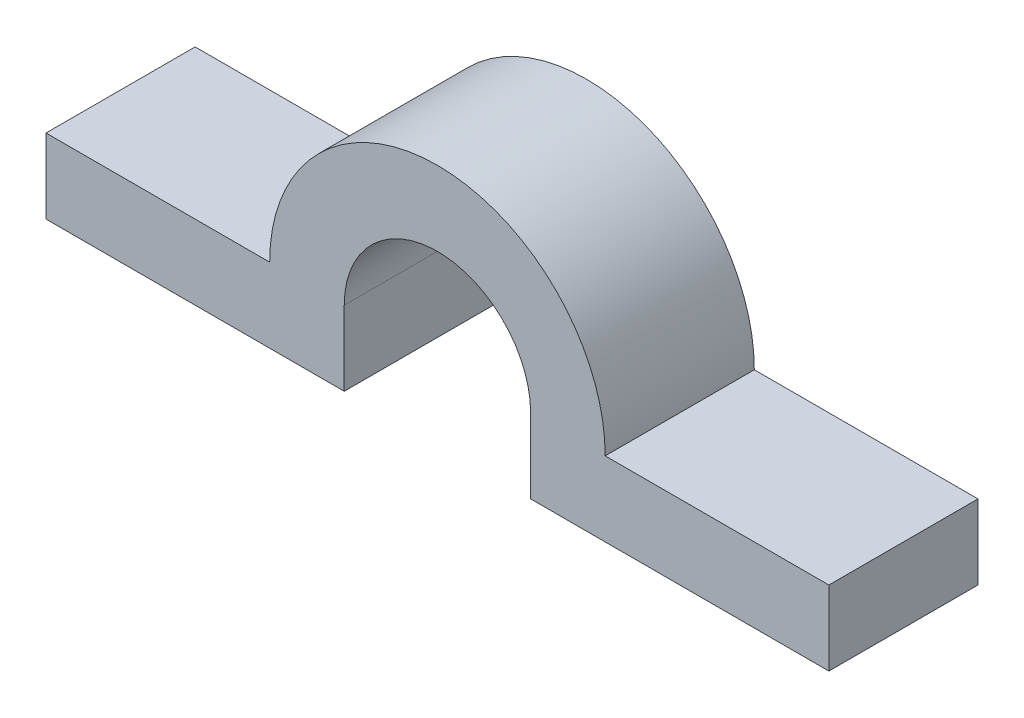
ISO-10303-21;
HEADER;
FILE_DESCRIPTION(('STEP AP214'),'2;1');
FILE_NAME('part.step','',(''),(''),'','','');
FILE_SCHEMA(('AUTOMOTIVE_DESIGN { 1 0 10303 214 1 1 1 1 }'));
ENDSEC;
DATA;
#1=APPLICATION_CONTEXT('core data for automotive mechanical design processes');
#2=APPLICATION_PROTOCOL_DEFINITION('international standard','automotive_design',2000,#1);
#3=PRODUCT_CONTEXT('',#1,'mechanical');
#4=PRODUCT('Part','Part','',(#3));
#5=PRODUCT_RELATED_PRODUCT_CATEGORY('part','',(#4));
#6=PRODUCT_DEFINITION_FORMATION('','',#4);
#7=PRODUCT_DEFINITION_CONTEXT('part definition',#1,'design');
#8=PRODUCT_DEFINITION('design','',#6,#7);
#9=PRODUCT_DEFINITION_SHAPE('','',#8);
#10=(LENGTH_UNIT() NAMED_UNIT(*) SI_UNIT(.MILLI.,.METRE.));
#11=(NAMED_UNIT(*) PLANE_ANGLE_UNIT() SI_UNIT($,.RADIAN.));
#12=(NAMED_UNIT(*) SI_UNIT($,.STERADIAN.) SOLID_ANGLE_UNIT());
#13=UNCERTAINTY_MEASURE_WITH_UNIT(LENGTH_MEASURE(1.E-05),#10,'distance_accuracy_value','');
#14=(GEOMETRIC_REPRESENTATION_CONTEXT(3) GLOBAL_UNCERTAINTY_ASSIGNED_CONTEXT((#13)) GLOBAL_UNIT_ASSIGNED_CONTEXT((#10,
#11,#12)) REPRESENTATION_CONTEXT('',''));
#15=CARTESIAN_POINT('',(0.,0.,0.));
#16=DIRECTION('',(0.,0.,1.));
#17=DIRECTION('',(1.,0.,0.));
#18=AXIS2_PLACEMENT_3D('',#15,#16,#17);
#19=CARTESIAN_POINT('',(13.,0.,8.));
#20=DIRECTION('',(0.,0.,-1.));
#21=DIRECTION('',(-1.,0.,0.));
#22=AXIS2_PLACEMENT_3D('',#19,#20,#21);
#23=CYLINDRICAL_SURFACE('',#22,5.);
#24=CARTESIAN_POINT('',(13.,0.,0.));
#25=DIRECTION('',(0.,0.,-1.));
#26=DIRECTION('',(1.,0.,0.));
#27=AXIS2_PLACEMENT_3D('',#24,#25,#26);
#28=CIRCLE('',#27,5.);
#29=CARTESIAN_POINT('',(8.,0.,0.));
#30=VERTEX_POINT('',#29);
#31=CARTESIAN_POINT('',(18.,0.,0.));
#32=VERTEX_POINT('',#31);
#33=EDGE_CURVE('E145',#30,#32,#28,.T.);
#34=ORIENTED_EDGE('',*,*,#33,.T.);
#35=DIRECTION('',(0.,0.,-1.));
#36=VECTOR('',#35,1.);
#37=CARTESIAN_POINT('',(18.,0.,8.));
#38=LINE('',#37,#36);
#39=CARTESIAN_POINT('',(18.,0.,8.));
#40=VERTEX_POINT('',#39);
#41=EDGE_CURVE('E11',#40,#32,#38,.T.);
#42=ORIENTED_EDGE('',*,*,#41,.F.);
#43=CARTESIAN_POINT('',(13.,0.,8.));
#44=DIRECTION('',(0.,0.,-1.));
#45=DIRECTION('',(1.,0.,0.));
#46=AXIS2_PLACEMENT_3D('',#43,#44,#45);
#47=CIRCLE('',#46,5.);
#48=CARTESIAN_POINT('',(8.,0.,8.));
#49=VERTEX_POINT('',#48);
#50=EDGE_CURVE('E163',#49,#40,#47,.T.);
#51=ORIENTED_EDGE('',*,*,#50,.F.);
#52=DIRECTION('',(0.,0.,-1.));
#53=VECTOR('',#52,1.);
#54=CARTESIAN_POINT('',(8.,0.,8.));
#55=LINE('',#54,#53);
#56=EDGE_CURVE('E141',#49,#30,#55,.T.);
#57=ORIENTED_EDGE('',*,*,#56,.T.);
#58=EDGE_LOOP('',(#34,#42,#51,#57));
#59=FACE_BOUND('',#58,.T.);
#60=ADVANCED_FACE('F37',(#59),#23,.F.);
#61=CARTESIAN_POINT('',(18.,0.,8.));
#62=DIRECTION('',(1.,0.,0.));
#63=DIRECTION('',(0.,0.,-1.));
#64=AXIS2_PLACEMENT_3D('',#61,#62,#63);
#65=PLANE('',#64);
#66=DIRECTION('',(0.,-1.,0.));
#67=VECTOR('',#66,1.);
#68=CARTESIAN_POINT('',(18.,0.,0.));
#69=LINE('',#68,#67);
#70=CARTESIAN_POINT('',(18.,-4.,0.));
#71=VERTEX_POINT('',#70);
#72=EDGE_CURVE('E148',#32,#71,#69,.T.);
#73=ORIENTED_EDGE('',*,*,#72,.T.);
#74=DIRECTION('',(0.,0.,-1.));
#75=VECTOR('',#74,1.);
#76=CARTESIAN_POINT('',(18.,-4.,8.));
#77=LINE('',#76,#75);
#78=CARTESIAN_POINT('',(18.,-4.,8.));
#79=VERTEX_POINT('',#78);
#80=EDGE_CURVE('E45',#79,#71,#77,.T.);
#81=ORIENTED_EDGE('',*,*,#80,.F.);
#82=DIRECTION('',(0.,-1.,0.));
#83=VECTOR('',#82,1.);
#84=CARTESIAN_POINT('',(18.,0.,8.));
#85=LINE('',#84,#83);
#86=EDGE_CURVE('E101',#40,#79,#85,.T.);
#87=ORIENTED_EDGE('',*,*,#86,.F.);
#88=ORIENTED_EDGE('',*,*,#41,.T.);
#89=EDGE_LOOP('',(#73,#81,#87,#88));
#90=FACE_BOUND('',#89,.T.);
#91=ADVANCED_FACE('F212',(#90),#65,.F.);
#92=CARTESIAN_POINT('',(18.,-4.,8.));
#93=DIRECTION('',(0.,1.,0.));
#94=DIRECTION('',(0.,0.,1.));
#95=AXIS2_PLACEMENT_3D('',#92,#93,#94);
#96=PLANE('',#95);
#97=DIRECTION('',(1.,0.,0.));
#98=VECTOR('',#97,1.);
#99=CARTESIAN_POINT('',(18.,-4.,0.));
#100=LINE('',#99,#98);
#101=CARTESIAN_POINT('',(34.,-4.,0.));
#102=VERTEX_POINT('',#101);
#103=EDGE_CURVE('E150',#71,#102,#100,.T.);
#104=ORIENTED_EDGE('',*,*,#103,.T.);
#105=DIRECTION('',(0.,0.,-1.));
#106=VECTOR('',#105,1.);
#107=CARTESIAN_POINT('',(34.,-4.,8.));
#108=LINE('',#107,#106);
#109=CARTESIAN_POINT('',(34.,-4.,8.));
#110=VERTEX_POINT('',#109);
#111=EDGE_CURVE('E176',#110,#102,#108,.T.);
#112=ORIENTED_EDGE('',*,*,#111,.F.);
#113=DIRECTION('',(1.,0.,0.));
#114=VECTOR('',#113,1.);
#115=CARTESIAN_POINT('',(18.,-4.,8.));
#116=LINE('',#115,#114);
#117=EDGE_CURVE('E184',#79,#110,#116,.T.);
#118=ORIENTED_EDGE('',*,*,#117,.F.);
#119=ORIENTED_EDGE('',*,*,#80,.T.);
#120=EDGE_LOOP('',(#104,#112,#118,#119));
#121=FACE_BOUND('',#120,.T.);
#122=ADVANCED_FACE('F182',(#121),#96,.F.);
#123=CARTESIAN_POINT('',(34.,-4.,8.));
#124=DIRECTION('',(-1.,0.,0.));
#125=DIRECTION('',(0.,0.,1.));
#126=AXIS2_PLACEMENT_3D('',#123,#124,#125);
#127=PLANE('',#126);
#128=DIRECTION('',(0.,1.,0.));
#129=VECTOR('',#128,1.);
#130=CARTESIAN_POINT('',(34.,-4.,0.));
#131=LINE('',#130,#129);
#132=CARTESIAN_POINT('',(34.,0.,0.));
#133=VERTEX_POINT('',#132);
#134=EDGE_CURVE('E152',#102,#133,#131,.T.);
#135=ORIENTED_EDGE('',*,*,#134,.T.);
#136=DIRECTION('',(0.,0.,-1.));
#137=VECTOR('',#136,1.);
#138=CARTESIAN_POINT('',(34.,0.,8.));
#139=LINE('',#138,#137);
#140=CARTESIAN_POINT('',(34.,0.,8.));
#141=VERTEX_POINT('',#140);
#142=EDGE_CURVE('E173',#141,#133,#139,.T.);
#143=ORIENTED_EDGE('',*,*,#142,.F.);
#144=DIRECTION('',(0.,1.,0.));
#145=VECTOR('',#144,1.);
#146=CARTESIAN_POINT('',(34.,-4.,8.));
#147=LINE('',#146,#145);
#148=EDGE_CURVE('E202',#110,#141,#147,.T.);
#149=ORIENTED_EDGE('',*,*,#148,.F.);
#150=ORIENTED_EDGE('',*,*,#111,.T.);
#151=EDGE_LOOP('',(#135,#143,#149,#150));
#152=FACE_BOUND('',#151,.T.);
#153=ADVANCED_FACE('F193',(#152),#127,.F.);
#154=CARTESIAN_POINT('',(22.,0.,8.));
#155=DIRECTION('',(0.,-1.,0.));
#156=DIRECTION('',(1.,0.,0.));
#157=AXIS2_PLACEMENT_3D('',#154,#155,#156);
#158=PLANE('',#157);
#159=DIRECTION('',(-1.,0.,0.));
#160=VECTOR('',#159,1.);
#161=CARTESIAN_POINT('',(22.,0.,0.));
#162=LINE('',#161,#160);
#163=CARTESIAN_POINT('',(22.,0.,0.));
#164=VERTEX_POINT('',#163);
#165=EDGE_CURVE('E154',#133,#164,#162,.T.);
#166=ORIENTED_EDGE('',*,*,#165,.T.);
#167=DIRECTION('',(0.,0.,-1.));
#168=VECTOR('',#167,1.);
#169=CARTESIAN_POINT('',(22.,0.,8.));
#170=LINE('',#169,#168);
#171=CARTESIAN_POINT('',(22.,0.,8.));
#172=VERTEX_POINT('',#171);
#173=EDGE_CURVE('E170',#172,#164,#170,.T.);
#174=ORIENTED_EDGE('',*,*,#173,.F.);
#175=DIRECTION('',(-1.,0.,0.));
#176=VECTOR('',#175,1.);
#177=CARTESIAN_POINT('',(22.,0.,8.));
#178=LINE('',#177,#176);
#179=EDGE_CURVE('E199',#141,#172,#178,.T.);
#180=ORIENTED_EDGE('',*,*,#179,.F.);
#181=ORIENTED_EDGE('',*,*,#142,.T.);
#182=EDGE_LOOP('',(#166,#174,#180,#181));
#183=FACE_BOUND('',#182,.T.);
#184=ADVANCED_FACE('F197',(#183),#158,.F.);
#185=CARTESIAN_POINT('',(13.,0.,8.));
#186=DIRECTION('',(0.,0.,-1.));
#187=DIRECTION('',(-1.,0.,0.));
#188=AXIS2_PLACEMENT_3D('',#185,#186,#187);
#189=CYLINDRICAL_SURFACE('',#188,9.);
#190=CARTESIAN_POINT('',(13.,0.,0.));
#191=DIRECTION('',(0.,0.,1.));
#192=DIRECTION('',(1.,0.,0.));
#193=AXIS2_PLACEMENT_3D('',#190,#191,#192);
#194=CIRCLE('',#193,9.);
#195=CARTESIAN_POINT('',(4.,0.,0.));
#196=VERTEX_POINT('',#195);
#197=EDGE_CURVE('E156',#164,#196,#194,.T.);
#198=ORIENTED_EDGE('',*,*,#197,.T.);
#199=DIRECTION('',(0.,0.,-1.));
#200=VECTOR('',#199,1.);
#201=CARTESIAN_POINT('',(4.,0.,8.));
#202=LINE('',#201,#200);
#203=CARTESIAN_POINT('',(4.,0.,8.));
#204=VERTEX_POINT('',#203);
#205=EDGE_CURVE('E167',#204,#196,#202,.T.);
#206=ORIENTED_EDGE('',*,*,#205,.F.);
#207=CARTESIAN_POINT('',(13.,0.,8.));
#208=DIRECTION('',(0.,0.,1.));
#209=DIRECTION('',(1.,0.,0.));
#210=AXIS2_PLACEMENT_3D('',#207,#208,#209);
#211=CIRCLE('',#210,9.);
#212=EDGE_CURVE('E201',#172,#204,#211,.T.);
#213=ORIENTED_EDGE('',*,*,#212,.F.);
#214=ORIENTED_EDGE('',*,*,#173,.T.);
#215=EDGE_LOOP('',(#198,#206,#213,#214));
#216=FACE_BOUND('',#215,.T.);
#217=ADVANCED_FACE('F224',(#216),#189,.T.);
#218=CARTESIAN_POINT('',(4.,0.,8.));
#219=DIRECTION('',(0.,-1.,0.));
#220=DIRECTION('',(1.,0.,0.));
#221=AXIS2_PLACEMENT_3D('',#218,#219,#220);
#222=PLANE('',#221);
#223=DIRECTION('',(-1.,0.,0.));
#224=VECTOR('',#223,1.);
#225=CARTESIAN_POINT('',(4.,0.,0.));
#226=LINE('',#225,#224);
#227=CARTESIAN_POINT('',(-8.,0.,0.));
#228=VERTEX_POINT('',#227);
#229=EDGE_CURVE('E158',#196,#228,#226,.T.);
#230=ORIENTED_EDGE('',*,*,#229,.T.);
#231=DIRECTION('',(0.,0.,-1.));
#232=VECTOR('',#231,1.);
#233=CARTESIAN_POINT('',(-8.,0.,8.));
#234=LINE('',#233,#232);
#235=CARTESIAN_POINT('',(-8.,0.,8.));
#236=VERTEX_POINT('',#235);
#237=EDGE_CURVE('E136',#236,#228,#234,.T.);
#238=ORIENTED_EDGE('',*,*,#237,.F.);
#239=DIRECTION('',(-1.,0.,0.));
#240=VECTOR('',#239,1.);
#241=CARTESIAN_POINT('',(4.,0.,8.));
#242=LINE('',#241,#240);
#243=EDGE_CURVE('E126',#204,#236,#242,.T.);
#244=ORIENTED_EDGE('',*,*,#243,.F.);
#245=ORIENTED_EDGE('',*,*,#205,.T.);
#246=EDGE_LOOP('',(#230,#238,#244,#245));
#247=FACE_BOUND('',#246,.T.);
#248=ADVANCED_FACE('F227',(#247),#222,.F.);
#249=CARTESIAN_POINT('',(-8.,0.,8.));
#250=DIRECTION('',(1.,0.,0.));
#251=DIRECTION('',(0.,0.,-1.));
#252=AXIS2_PLACEMENT_3D('',#249,#250,#251);
#253=PLANE('',#252);
#254=DIRECTION('',(0.,-1.,0.));
#255=VECTOR('',#254,1.);
#256=CARTESIAN_POINT('',(-8.,0.,0.));
#257=LINE('',#256,#255);
#258=CARTESIAN_POINT('',(-8.,-4.,0.));
#259=VERTEX_POINT('',#258);
#260=EDGE_CURVE('E135',#228,#259,#257,.T.);
#261=ORIENTED_EDGE('',*,*,#260,.T.);
#262=DIRECTION('',(0.,0.,-1.));
#263=VECTOR('',#262,1.);
#264=CARTESIAN_POINT('',(-8.,-4.,8.));
#265=LINE('',#264,#263);
#266=CARTESIAN_POINT('',(-8.,-4.,8.));
#267=VERTEX_POINT('',#266);
#268=EDGE_CURVE('E132',#267,#259,#265,.T.);
#269=ORIENTED_EDGE('',*,*,#268,.F.);
#270=DIRECTION('',(0.,-1.,0.));
#271=VECTOR('',#270,1.);
#272=CARTESIAN_POINT('',(-8.,0.,8.));
#273=LINE('',#272,#271);
#274=EDGE_CURVE('E120',#236,#267,#273,.T.);
#275=ORIENTED_EDGE('',*,*,#274,.F.);
#276=ORIENTED_EDGE('',*,*,#237,.T.);
#277=EDGE_LOOP('',(#261,#269,#275,#276));
#278=FACE_BOUND('',#277,.T.);
#279=ADVANCED_FACE('F133',(#278),#253,.F.);
#280=CARTESIAN_POINT('',(0.,-4.,8.));
#281=DIRECTION('',(0.,1.,0.));
#282=DIRECTION('',(0.,0.,1.));
#283=AXIS2_PLACEMENT_3D('',#280,#281,#282);
#284=PLANE('',#283);
#285=DIRECTION('',(1.,0.,0.));
#286=VECTOR('',#285,1.);
#287=CARTESIAN_POINT('',(0.,-4.,0.));
#288=LINE('',#287,#286);
#289=CARTESIAN_POINT('',(8.,-4.,0.));
#290=VERTEX_POINT('',#289);
#291=EDGE_CURVE('E87',#259,#290,#288,.T.);
#292=ORIENTED_EDGE('',*,*,#291,.T.);
#293=DIRECTION('',(0.,0.,-1.));
#294=VECTOR('',#293,1.);
#295=CARTESIAN_POINT('',(8.,-4.,8.));
#296=LINE('',#295,#294);
#297=CARTESIAN_POINT('',(8.,-4.,8.));
#298=VERTEX_POINT('',#297);
#299=EDGE_CURVE('E137',#298,#290,#296,.T.);
#300=ORIENTED_EDGE('',*,*,#299,.F.);
#301=DIRECTION('',(1.,0.,0.));
#302=VECTOR('',#301,1.);
#303=CARTESIAN_POINT('',(-8.,-4.,8.));
#304=LINE('',#303,#302);
#305=EDGE_CURVE('E124',#267,#298,#304,.T.);
#306=ORIENTED_EDGE('',*,*,#305,.F.);
#307=ORIENTED_EDGE('',*,*,#268,.T.);
#308=EDGE_LOOP('',(#292,#300,#306,#307));
#309=FACE_BOUND('',#308,.T.);
#310=ADVANCED_FACE('F139',(#309),#284,.F.);
#311=CARTESIAN_POINT('',(8.,-4.,8.));
#312=DIRECTION('',(-1.,0.,0.));
#313=DIRECTION('',(0.,0.,1.));
#314=AXIS2_PLACEMENT_3D('',#311,#312,#313);
#315=PLANE('',#314);
#316=DIRECTION('',(0.,1.,0.));
#317=VECTOR('',#316,1.);
#318=CARTESIAN_POINT('',(8.,-4.,0.));
#319=LINE('',#318,#317);
#320=EDGE_CURVE('E93',#290,#30,#319,.T.);
#321=ORIENTED_EDGE('',*,*,#320,.T.);
#322=ORIENTED_EDGE('',*,*,#56,.F.);
#323=DIRECTION('',(0.,1.,0.));
#324=VECTOR('',#323,1.);
#325=CARTESIAN_POINT('',(8.,-4.,8.));
#326=LINE('',#325,#324);
#327=EDGE_CURVE('E53',#298,#49,#326,.T.);
#328=ORIENTED_EDGE('',*,*,#327,.F.);
#329=ORIENTED_EDGE('',*,*,#299,.T.);
#330=EDGE_LOOP('',(#321,#322,#328,#329));
#331=FACE_BOUND('',#330,.T.);
#332=ADVANCED_FACE('F236',(#331),#315,.F.);
#333=CARTESIAN_POINT('',(13.,0.,8.));
#334=DIRECTION('',(0.,0.,1.));
#335=DIRECTION('',(1.,0.,0.));
#336=AXIS2_PLACEMENT_3D('',#333,#334,#335);
#337=PLANE('',#336);
#338=ORIENTED_EDGE('',*,*,#50,.T.);
#339=ORIENTED_EDGE('',*,*,#86,.T.);
#340=ORIENTED_EDGE('',*,*,#117,.T.);
#341=ORIENTED_EDGE('',*,*,#148,.T.);
#342=ORIENTED_EDGE('',*,*,#179,.T.);
#343=ORIENTED_EDGE('',*,*,#212,.T.);
#344=ORIENTED_EDGE('',*,*,#243,.T.);
#345=ORIENTED_EDGE('',*,*,#274,.T.);
#346=ORIENTED_EDGE('',*,*,#305,.T.);
#347=ORIENTED_EDGE('',*,*,#327,.T.);
#348=EDGE_LOOP('',(#338,#339,#340,#341,#342,#343,#344,#345,#346,#347));
#349=FACE_BOUND('',#348,.T.);
#350=ADVANCED_FACE('F122',(#349),#337,.T.);
#351=CARTESIAN_POINT('',(13.,0.,0.));
#352=DIRECTION('',(0.,0.,1.));
#353=DIRECTION('',(1.,0.,0.));
#354=AXIS2_PLACEMENT_3D('',#351,#352,#353);
#355=PLANE('',#354);
#356=ORIENTED_EDGE('',*,*,#33,.F.);
#357=ORIENTED_EDGE('',*,*,#320,.F.);
#358=ORIENTED_EDGE('',*,*,#291,.F.);
#359=ORIENTED_EDGE('',*,*,#260,.F.);
#360=ORIENTED_EDGE('',*,*,#229,.F.);
#361=ORIENTED_EDGE('',*,*,#197,.F.);
#362=ORIENTED_EDGE('',*,*,#165,.F.);
#363=ORIENTED_EDGE('',*,*,#134,.F.);
#364=ORIENTED_EDGE('',*,*,#103,.F.);
#365=ORIENTED_EDGE('',*,*,#72,.F.);
#366=EDGE_LOOP('',(#356,#357,#358,#359,#360,#361,#362,#363,#364,#365));
#367=FACE_BOUND('',#366,.T.);
#368=ADVANCED_FACE('F188',(#367),#355,.F.);
#369=CLOSED_SHELL('',(#60,#91,#122,#153,#184,#217,#248,#279,#310,#332,#350,#368));
#370=MANIFOLD_SOLID_BREP('B2',#369);
#371=ADVANCED_BREP_SHAPE_REPRESENTATION('',(#18,#370),#14);
#372=SHAPE_DEFINITION_REPRESENTATION(#9,#371);
ENDSEC;
END-ISO-10303-21;
